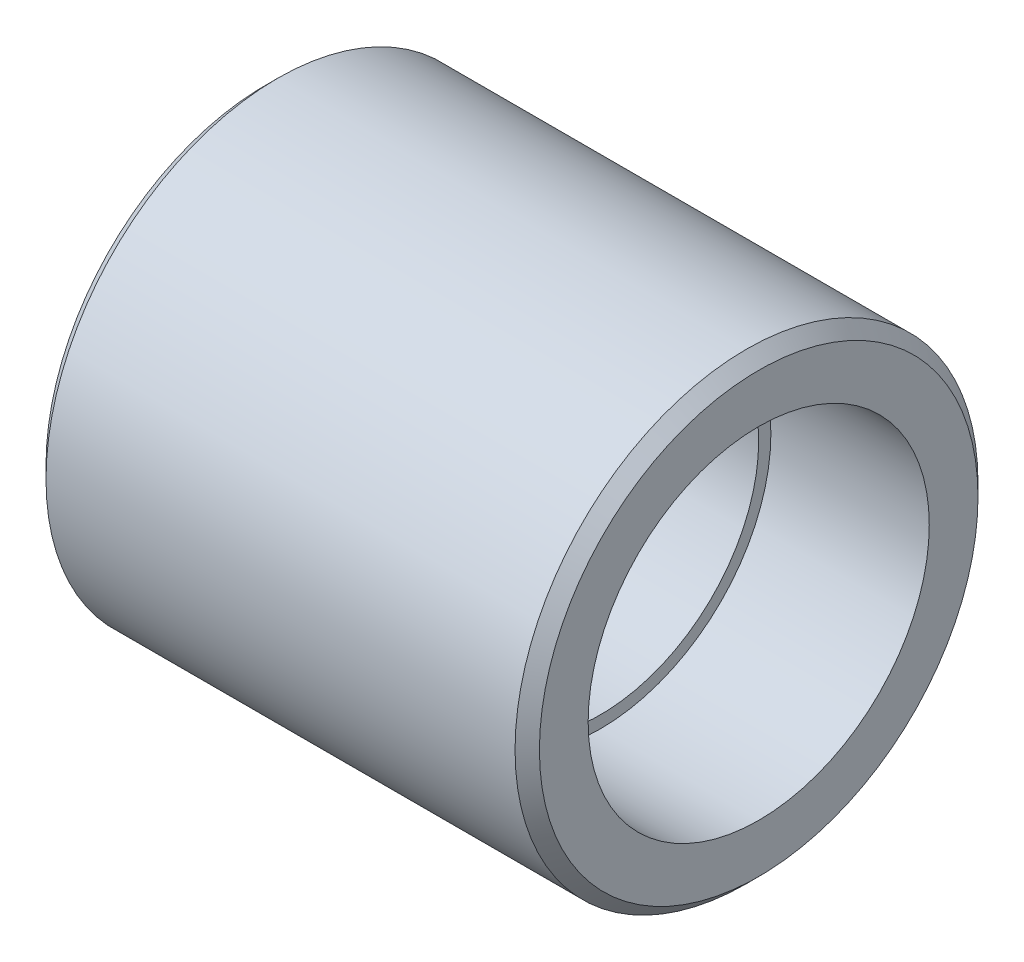
ISO-10303-21;
HEADER;
FILE_DESCRIPTION(('STEP AP214'),'2;1');
FILE_NAME('part.step','',(''),(''),'','','');
FILE_SCHEMA(('AUTOMOTIVE_DESIGN { 1 0 10303 214 1 1 1 1 }'));
ENDSEC;
DATA;
#1=APPLICATION_CONTEXT('core data for automotive mechanical design processes');
#2=APPLICATION_PROTOCOL_DEFINITION('international standard','automotive_design',2000,#1);
#3=PRODUCT_CONTEXT('',#1,'mechanical');
#4=PRODUCT('Part','Part','',(#3));
#5=PRODUCT_RELATED_PRODUCT_CATEGORY('part','',(#4));
#6=PRODUCT_DEFINITION_FORMATION('','',#4);
#7=PRODUCT_DEFINITION_CONTEXT('part definition',#1,'design');
#8=PRODUCT_DEFINITION('design','',#6,#7);
#9=PRODUCT_DEFINITION_SHAPE('','',#8);
#10=(LENGTH_UNIT() NAMED_UNIT(*) SI_UNIT(.MILLI.,.METRE.));
#11=(NAMED_UNIT(*) PLANE_ANGLE_UNIT() SI_UNIT($,.RADIAN.));
#12=(NAMED_UNIT(*) SI_UNIT($,.STERADIAN.) SOLID_ANGLE_UNIT());
#13=UNCERTAINTY_MEASURE_WITH_UNIT(LENGTH_MEASURE(1.E-05),#10,'distance_accuracy_value','');
#14=(GEOMETRIC_REPRESENTATION_CONTEXT(3) GLOBAL_UNCERTAINTY_ASSIGNED_CONTEXT((#13)) GLOBAL_UNIT_ASSIGNED_CONTEXT((#10,
#11,#12)) REPRESENTATION_CONTEXT('',''));
#15=CARTESIAN_POINT('',(0.,0.,0.));
#16=DIRECTION('',(0.,0.,1.));
#17=DIRECTION('',(1.,0.,0.));
#18=AXIS2_PLACEMENT_3D('',#15,#16,#17);
#19=CARTESIAN_POINT('',(1.,0.,0.));
#20=DIRECTION('',(1.,0.,0.));
#21=DIRECTION('',(0.,0.,-1.));
#22=AXIS2_PLACEMENT_3D('',#19,#20,#21);
#23=CONICAL_SURFACE('',#22,19.,0.78539816339745);
#24=CARTESIAN_POINT('',(0.,0.,0.));
#25=DIRECTION('',(-1.,0.,0.));
#26=DIRECTION('',(0.,0.,1.));
#27=AXIS2_PLACEMENT_3D('',#24,#25,#26);
#28=CIRCLE('',#27,18.);
#29=CARTESIAN_POINT('',(0.,0.,18.));
#30=VERTEX_POINT('',#29);
#31=EDGE_CURVE('E63',#30,#30,#28,.T.);
#32=ORIENTED_EDGE('',*,*,#31,.F.);
#33=EDGE_LOOP('',(#32));
#34=FACE_BOUND('',#33,.T.);
#35=CARTESIAN_POINT('',(1.,0.,0.));
#36=DIRECTION('',(-1.,0.,0.));
#37=DIRECTION('',(0.,0.,1.));
#38=AXIS2_PLACEMENT_3D('',#35,#36,#37);
#39=CIRCLE('',#38,19.);
#40=CARTESIAN_POINT('',(1.,0.,19.));
#41=VERTEX_POINT('',#40);
#42=EDGE_CURVE('E10',#41,#41,#39,.T.);
#43=ORIENTED_EDGE('',*,*,#42,.T.);
#44=EDGE_LOOP('',(#43));
#45=FACE_BOUND('',#44,.T.);
#46=ADVANCED_FACE('F29',(#34,#45),#23,.T.);
#47=CARTESIAN_POINT('',(0.,0.,0.));
#48=DIRECTION('',(-1.,0.,0.));
#49=DIRECTION('',(0.,0.,1.));
#50=AXIS2_PLACEMENT_3D('',#47,#48,#49);
#51=CYLINDRICAL_SURFACE('',#50,19.);
#52=ORIENTED_EDGE('',*,*,#42,.F.);
#53=EDGE_LOOP('',(#52));
#54=FACE_BOUND('',#53,.T.);
#55=CARTESIAN_POINT('',(39.5,0.,0.));
#56=DIRECTION('',(-1.,0.,0.));
#57=DIRECTION('',(0.,0.,1.));
#58=AXIS2_PLACEMENT_3D('',#55,#56,#57);
#59=CIRCLE('',#58,19.);
#60=CARTESIAN_POINT('',(39.5,0.,19.));
#61=VERTEX_POINT('',#60);
#62=EDGE_CURVE('E35',#61,#61,#59,.T.);
#63=ORIENTED_EDGE('',*,*,#62,.T.);
#64=EDGE_LOOP('',(#63));
#65=FACE_BOUND('',#64,.T.);
#66=ADVANCED_FACE('F70',(#54,#65),#51,.T.);
#67=CARTESIAN_POINT('',(40.5,0.,0.));
#68=DIRECTION('',(-1.,0.,0.));
#69=DIRECTION('',(0.,0.,1.));
#70=AXIS2_PLACEMENT_3D('',#67,#68,#69);
#71=CONICAL_SURFACE('',#70,18.,0.78539816339745);
#72=ORIENTED_EDGE('',*,*,#62,.F.);
#73=EDGE_LOOP('',(#72));
#74=FACE_BOUND('',#73,.T.);
#75=CARTESIAN_POINT('',(40.5,0.,0.));
#76=DIRECTION('',(-1.,0.,0.));
#77=DIRECTION('',(0.,0.,1.));
#78=AXIS2_PLACEMENT_3D('',#75,#76,#77);
#79=CIRCLE('',#78,18.);
#80=CARTESIAN_POINT('',(40.5,0.,18.));
#81=VERTEX_POINT('',#80);
#82=EDGE_CURVE('E39',#81,#81,#79,.T.);
#83=ORIENTED_EDGE('',*,*,#82,.T.);
#84=EDGE_LOOP('',(#83));
#85=FACE_BOUND('',#84,.T.);
#86=ADVANCED_FACE('F74',(#74,#85),#71,.T.);
#87=CARTESIAN_POINT('',(40.5000000000001,18.,0.));
#88=DIRECTION('',(-1.,0.,0.));
#89=DIRECTION('',(0.,0.,1.));
#90=AXIS2_PLACEMENT_3D('',#87,#88,#89);
#91=PLANE('',#90);
#92=ORIENTED_EDGE('',*,*,#82,.F.);
#93=EDGE_LOOP('',(#92));
#94=FACE_BOUND('',#93,.T.);
#95=CARTESIAN_POINT('',(40.5,0.,0.));
#96=DIRECTION('',(-1.,0.,0.));
#97=DIRECTION('',(0.,0.,1.));
#98=AXIS2_PLACEMENT_3D('',#95,#96,#97);
#99=CIRCLE('',#98,14.);
#100=CARTESIAN_POINT('',(40.5,0.,14.));
#101=VERTEX_POINT('',#100);
#102=EDGE_CURVE('E43',#101,#101,#99,.T.);
#103=ORIENTED_EDGE('',*,*,#102,.T.);
#104=EDGE_LOOP('',(#103));
#105=FACE_BOUND('',#104,.T.);
#106=ADVANCED_FACE('F79',(#94,#105),#91,.F.);
#107=CARTESIAN_POINT('',(0.,0.,0.));
#108=DIRECTION('',(-1.,0.,0.));
#109=DIRECTION('',(0.,0.,1.));
#110=AXIS2_PLACEMENT_3D('',#107,#108,#109);
#111=CYLINDRICAL_SURFACE('',#110,14.);
#112=ORIENTED_EDGE('',*,*,#102,.F.);
#113=EDGE_LOOP('',(#112));
#114=FACE_BOUND('',#113,.T.);
#115=CARTESIAN_POINT('',(27.5,0.,0.));
#116=DIRECTION('',(-1.,0.,0.));
#117=DIRECTION('',(0.,0.,1.));
#118=AXIS2_PLACEMENT_3D('',#115,#116,#117);
#119=CIRCLE('',#118,14.);
#120=CARTESIAN_POINT('',(27.5,0.,14.));
#121=VERTEX_POINT('',#120);
#122=EDGE_CURVE('E48',#121,#121,#119,.T.);
#123=ORIENTED_EDGE('',*,*,#122,.T.);
#124=EDGE_LOOP('',(#123));
#125=FACE_BOUND('',#124,.T.);
#126=ADVANCED_FACE('F85',(#114,#125),#111,.F.);
#127=CARTESIAN_POINT('',(27.5000000000001,14.0000000000001,0.));
#128=DIRECTION('',(-1.,0.,0.));
#129=DIRECTION('',(0.,0.,1.));
#130=AXIS2_PLACEMENT_3D('',#127,#128,#129);
#131=PLANE('',#130);
#132=ORIENTED_EDGE('',*,*,#122,.F.);
#133=EDGE_LOOP('',(#132));
#134=FACE_BOUND('',#133,.T.);
#135=CARTESIAN_POINT('',(27.5,0.,0.));
#136=DIRECTION('',(-1.,0.,0.));
#137=DIRECTION('',(0.,0.,1.));
#138=AXIS2_PLACEMENT_3D('',#135,#136,#137);
#139=CIRCLE('',#138,13.);
#140=CARTESIAN_POINT('',(27.5,0.,13.));
#141=VERTEX_POINT('',#140);
#142=EDGE_CURVE('E51',#141,#141,#139,.T.);
#143=ORIENTED_EDGE('',*,*,#142,.T.);
#144=EDGE_LOOP('',(#143));
#145=FACE_BOUND('',#144,.T.);
#146=ADVANCED_FACE('F89',(#134,#145),#131,.F.);
#147=CARTESIAN_POINT('',(0.,0.,0.));
#148=DIRECTION('',(-1.,0.,0.));
#149=DIRECTION('',(0.,0.,1.));
#150=AXIS2_PLACEMENT_3D('',#147,#148,#149);
#151=CYLINDRICAL_SURFACE('',#150,13.);
#152=ORIENTED_EDGE('',*,*,#142,.F.);
#153=EDGE_LOOP('',(#152));
#154=FACE_BOUND('',#153,.T.);
#155=CARTESIAN_POINT('',(9.99999999999999,0.,0.));
#156=DIRECTION('',(-1.,0.,0.));
#157=DIRECTION('',(0.,0.,1.));
#158=AXIS2_PLACEMENT_3D('',#155,#156,#157);
#159=CIRCLE('',#158,13.);
#160=CARTESIAN_POINT('',(9.99999999999999,0.,13.));
#161=VERTEX_POINT('',#160);
#162=EDGE_CURVE('E54',#161,#161,#159,.T.);
#163=ORIENTED_EDGE('',*,*,#162,.T.);
#164=EDGE_LOOP('',(#163));
#165=FACE_BOUND('',#164,.T.);
#166=ADVANCED_FACE('F93',(#154,#165),#151,.F.);
#167=CARTESIAN_POINT('',(10.0000000000001,13.0000000000001,0.));
#168=DIRECTION('',(1.,0.,0.));
#169=DIRECTION('',(0.,0.,-1.));
#170=AXIS2_PLACEMENT_3D('',#167,#168,#169);
#171=PLANE('',#170);
#172=ORIENTED_EDGE('',*,*,#162,.F.);
#173=EDGE_LOOP('',(#172));
#174=FACE_BOUND('',#173,.T.);
#175=CARTESIAN_POINT('',(9.99999999999999,0.,0.));
#176=DIRECTION('',(-1.,0.,0.));
#177=DIRECTION('',(0.,0.,1.));
#178=AXIS2_PLACEMENT_3D('',#175,#176,#177);
#179=CIRCLE('',#178,16.);
#180=CARTESIAN_POINT('',(9.99999999999999,0.,16.));
#181=VERTEX_POINT('',#180);
#182=EDGE_CURVE('E57',#181,#181,#179,.T.);
#183=ORIENTED_EDGE('',*,*,#182,.T.);
#184=EDGE_LOOP('',(#183));
#185=FACE_BOUND('',#184,.T.);
#186=ADVANCED_FACE('F97',(#174,#185),#171,.F.);
#187=CARTESIAN_POINT('',(0.,0.,0.));
#188=DIRECTION('',(-1.,0.,0.));
#189=DIRECTION('',(0.,0.,1.));
#190=AXIS2_PLACEMENT_3D('',#187,#188,#189);
#191=CYLINDRICAL_SURFACE('',#190,16.);
#192=ORIENTED_EDGE('',*,*,#182,.F.);
#193=EDGE_LOOP('',(#192));
#194=FACE_BOUND('',#193,.T.);
#195=CARTESIAN_POINT('',(0.,0.,0.));
#196=DIRECTION('',(-1.,0.,0.));
#197=DIRECTION('',(0.,0.,1.));
#198=AXIS2_PLACEMENT_3D('',#195,#196,#197);
#199=CIRCLE('',#198,16.);
#200=CARTESIAN_POINT('',(0.,0.,16.));
#201=VERTEX_POINT('',#200);
#202=EDGE_CURVE('E60',#201,#201,#199,.T.);
#203=ORIENTED_EDGE('',*,*,#202,.T.);
#204=EDGE_LOOP('',(#203));
#205=FACE_BOUND('',#204,.T.);
#206=ADVANCED_FACE('F101',(#194,#205),#191,.F.);
#207=CARTESIAN_POINT('',(0.,18.0000000000001,0.));
#208=DIRECTION('',(1.,0.,0.));
#209=DIRECTION('',(0.,0.,-1.));
#210=AXIS2_PLACEMENT_3D('',#207,#208,#209);
#211=PLANE('',#210);
#212=ORIENTED_EDGE('',*,*,#202,.F.);
#213=EDGE_LOOP('',(#212));
#214=FACE_BOUND('',#213,.T.);
#215=ORIENTED_EDGE('',*,*,#31,.T.);
#216=EDGE_LOOP('',(#215));
#217=FACE_BOUND('',#216,.T.);
#218=ADVANCED_FACE('F67',(#214,#217),#211,.F.);
#219=CLOSED_SHELL('',(#46,#66,#86,#106,#126,#146,#166,#186,#206,#218));
#220=MANIFOLD_SOLID_BREP('B2',#219);
#221=ADVANCED_BREP_SHAPE_REPRESENTATION('',(#18,#220),#14);
#222=SHAPE_DEFINITION_REPRESENTATION(#9,#221);
ENDSEC;
END-ISO-10303-21;
